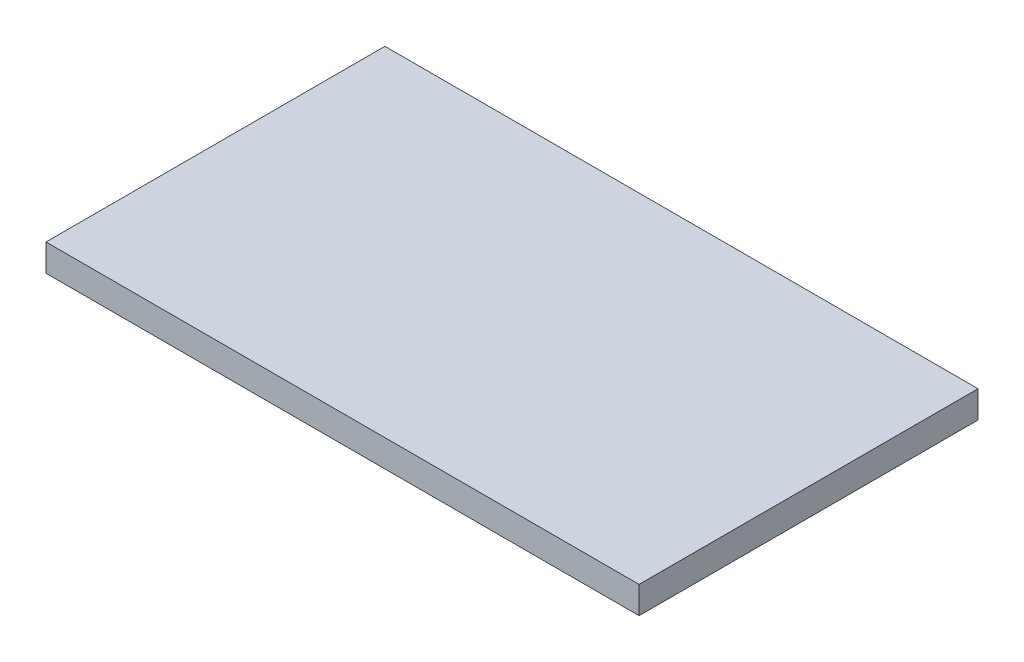
ISO-10303-21;
HEADER;
FILE_DESCRIPTION(('STEP AP214'),'2;1');
FILE_NAME('part.step','',(''),(''),'','','');
FILE_SCHEMA(('AUTOMOTIVE_DESIGN { 1 0 10303 214 1 1 1 1 }'));
ENDSEC;
DATA;
#1=APPLICATION_CONTEXT('core data for automotive mechanical design processes');
#2=APPLICATION_PROTOCOL_DEFINITION('international standard','automotive_design',2000,#1);
#3=PRODUCT_CONTEXT('',#1,'mechanical');
#4=PRODUCT('Part','Part','',(#3));
#5=PRODUCT_RELATED_PRODUCT_CATEGORY('part','',(#4));
#6=PRODUCT_DEFINITION_FORMATION('','',#4);
#7=PRODUCT_DEFINITION_CONTEXT('part definition',#1,'design');
#8=PRODUCT_DEFINITION('design','',#6,#7);
#9=PRODUCT_DEFINITION_SHAPE('','',#8);
#10=(LENGTH_UNIT() NAMED_UNIT(*) SI_UNIT(.MILLI.,.METRE.));
#11=(NAMED_UNIT(*) PLANE_ANGLE_UNIT() SI_UNIT($,.RADIAN.));
#12=(NAMED_UNIT(*) SI_UNIT($,.STERADIAN.) SOLID_ANGLE_UNIT());
#13=UNCERTAINTY_MEASURE_WITH_UNIT(LENGTH_MEASURE(1.E-05),#10,'distance_accuracy_value','');
#14=(GEOMETRIC_REPRESENTATION_CONTEXT(3) GLOBAL_UNCERTAINTY_ASSIGNED_CONTEXT((#13)) GLOBAL_UNIT_ASSIGNED_CONTEXT((#10,
#11,#12)) REPRESENTATION_CONTEXT('',''));
#15=CARTESIAN_POINT('',(0.,0.,0.));
#16=DIRECTION('',(0.,0.,1.));
#17=DIRECTION('',(1.,0.,0.));
#18=AXIS2_PLACEMENT_3D('',#15,#16,#17);
#19=CARTESIAN_POINT('',(0.,1.6,0.));
#20=DIRECTION('',(1.,0.,0.));
#21=DIRECTION('',(0.,0.,-1.));
#22=AXIS2_PLACEMENT_3D('',#19,#20,#21);
#23=PLANE('',#22);
#24=DIRECTION('',(0.,0.,1.));
#25=VECTOR('',#24,1.);
#26=CARTESIAN_POINT('',(0.,0.,0.));
#27=LINE('',#26,#25);
#28=CARTESIAN_POINT('',(0.,0.,-20.));
#29=VERTEX_POINT('',#28);
#30=CARTESIAN_POINT('',(0.,0.,0.));
#31=VERTEX_POINT('',#30);
#32=EDGE_CURVE('E98',#29,#31,#27,.T.);
#33=ORIENTED_EDGE('',*,*,#32,.T.);
#34=DIRECTION('',(0.,-1.,0.));
#35=VECTOR('',#34,1.);
#36=CARTESIAN_POINT('',(0.,1.6,0.));
#37=LINE('',#36,#35);
#38=CARTESIAN_POINT('',(0.,1.6,0.));
#39=VERTEX_POINT('',#38);
#40=EDGE_CURVE('E11',#39,#31,#37,.T.);
#41=ORIENTED_EDGE('',*,*,#40,.F.);
#42=DIRECTION('',(0.,0.,1.));
#43=VECTOR('',#42,1.);
#44=CARTESIAN_POINT('',(0.,1.6,0.));
#45=LINE('',#44,#43);
#46=CARTESIAN_POINT('',(0.,1.6,-20.));
#47=VERTEX_POINT('',#46);
#48=EDGE_CURVE('E86',#47,#39,#45,.T.);
#49=ORIENTED_EDGE('',*,*,#48,.F.);
#50=DIRECTION('',(0.,-1.,0.));
#51=VECTOR('',#50,1.);
#52=CARTESIAN_POINT('',(0.,1.6,-20.));
#53=LINE('',#52,#51);
#54=EDGE_CURVE('E94',#47,#29,#53,.T.);
#55=ORIENTED_EDGE('',*,*,#54,.T.);
#56=EDGE_LOOP('',(#33,#41,#49,#55));
#57=FACE_BOUND('',#56,.T.);
#58=ADVANCED_FACE('F35',(#57),#23,.F.);
#59=CARTESIAN_POINT('',(0.,1.6,0.));
#60=DIRECTION('',(0.,0.,-1.));
#61=DIRECTION('',(-1.,0.,0.));
#62=AXIS2_PLACEMENT_3D('',#59,#60,#61);
#63=PLANE('',#62);
#64=DIRECTION('',(1.,0.,0.));
#65=VECTOR('',#64,1.);
#66=CARTESIAN_POINT('',(0.,0.,0.));
#67=LINE('',#66,#65);
#68=CARTESIAN_POINT('',(35.,0.,0.));
#69=VERTEX_POINT('',#68);
#70=EDGE_CURVE('E90',#31,#69,#67,.T.);
#71=ORIENTED_EDGE('',*,*,#70,.T.);
#72=DIRECTION('',(0.,-1.,0.));
#73=VECTOR('',#72,1.);
#74=CARTESIAN_POINT('',(35.,1.6,0.));
#75=LINE('',#74,#73);
#76=CARTESIAN_POINT('',(35.,1.6,0.));
#77=VERTEX_POINT('',#76);
#78=EDGE_CURVE('E43',#77,#69,#75,.T.);
#79=ORIENTED_EDGE('',*,*,#78,.F.);
#80=DIRECTION('',(1.,0.,0.));
#81=VECTOR('',#80,1.);
#82=CARTESIAN_POINT('',(0.,1.6,0.));
#83=LINE('',#82,#81);
#84=EDGE_CURVE('E81',#39,#77,#83,.T.);
#85=ORIENTED_EDGE('',*,*,#84,.F.);
#86=ORIENTED_EDGE('',*,*,#40,.T.);
#87=EDGE_LOOP('',(#71,#79,#85,#86));
#88=FACE_BOUND('',#87,.T.);
#89=ADVANCED_FACE('F89',(#88),#63,.F.);
#90=CARTESIAN_POINT('',(35.,1.6,0.));
#91=DIRECTION('',(-1.,0.,0.));
#92=DIRECTION('',(0.,0.,1.));
#93=AXIS2_PLACEMENT_3D('',#90,#91,#92);
#94=PLANE('',#93);
#95=DIRECTION('',(0.,0.,-1.));
#96=VECTOR('',#95,1.);
#97=CARTESIAN_POINT('',(35.,0.,0.));
#98=LINE('',#97,#96);
#99=CARTESIAN_POINT('',(35.,0.,-20.));
#100=VERTEX_POINT('',#99);
#101=EDGE_CURVE('E68',#69,#100,#98,.T.);
#102=ORIENTED_EDGE('',*,*,#101,.T.);
#103=DIRECTION('',(0.,-1.,0.));
#104=VECTOR('',#103,1.);
#105=CARTESIAN_POINT('',(35.,1.6,-20.));
#106=LINE('',#105,#104);
#107=CARTESIAN_POINT('',(35.,1.6,-20.));
#108=VERTEX_POINT('',#107);
#109=EDGE_CURVE('E91',#108,#100,#106,.T.);
#110=ORIENTED_EDGE('',*,*,#109,.F.);
#111=DIRECTION('',(0.,0.,-1.));
#112=VECTOR('',#111,1.);
#113=CARTESIAN_POINT('',(35.,1.6,0.));
#114=LINE('',#113,#112);
#115=EDGE_CURVE('E84',#77,#108,#114,.T.);
#116=ORIENTED_EDGE('',*,*,#115,.F.);
#117=ORIENTED_EDGE('',*,*,#78,.T.);
#118=EDGE_LOOP('',(#102,#110,#116,#117));
#119=FACE_BOUND('',#118,.T.);
#120=ADVANCED_FACE('F92',(#119),#94,.F.);
#121=CARTESIAN_POINT('',(0.,1.6,-20.));
#122=DIRECTION('',(0.,0.,1.));
#123=DIRECTION('',(1.,0.,0.));
#124=AXIS2_PLACEMENT_3D('',#121,#122,#123);
#125=PLANE('',#124);
#126=DIRECTION('',(-1.,0.,0.));
#127=VECTOR('',#126,1.);
#128=CARTESIAN_POINT('',(0.,0.,-20.));
#129=LINE('',#128,#127);
#130=EDGE_CURVE('E74',#100,#29,#129,.T.);
#131=ORIENTED_EDGE('',*,*,#130,.T.);
#132=ORIENTED_EDGE('',*,*,#54,.F.);
#133=DIRECTION('',(-1.,0.,0.));
#134=VECTOR('',#133,1.);
#135=CARTESIAN_POINT('',(0.,1.6,-20.));
#136=LINE('',#135,#134);
#137=EDGE_CURVE('E51',#108,#47,#136,.T.);
#138=ORIENTED_EDGE('',*,*,#137,.F.);
#139=ORIENTED_EDGE('',*,*,#109,.T.);
#140=EDGE_LOOP('',(#131,#132,#138,#139));
#141=FACE_BOUND('',#140,.T.);
#142=ADVANCED_FACE('F105',(#141),#125,.F.);
#143=CARTESIAN_POINT('',(0.,1.6,0.));
#144=DIRECTION('',(0.,-1.,0.));
#145=DIRECTION('',(0.,0.,-1.));
#146=AXIS2_PLACEMENT_3D('',#143,#144,#145);
#147=PLANE('',#146);
#148=ORIENTED_EDGE('',*,*,#48,.T.);
#149=ORIENTED_EDGE('',*,*,#84,.T.);
#150=ORIENTED_EDGE('',*,*,#115,.T.);
#151=ORIENTED_EDGE('',*,*,#137,.T.);
#152=EDGE_LOOP('',(#148,#149,#150,#151));
#153=FACE_BOUND('',#152,.T.);
#154=ADVANCED_FACE('F82',(#153),#147,.F.);
#155=CARTESIAN_POINT('',(0.,0.,0.));
#156=DIRECTION('',(0.,-1.,0.));
#157=DIRECTION('',(0.,0.,-1.));
#158=AXIS2_PLACEMENT_3D('',#155,#156,#157);
#159=PLANE('',#158);
#160=ORIENTED_EDGE('',*,*,#32,.F.);
#161=ORIENTED_EDGE('',*,*,#130,.F.);
#162=ORIENTED_EDGE('',*,*,#101,.F.);
#163=ORIENTED_EDGE('',*,*,#70,.F.);
#164=EDGE_LOOP('',(#160,#161,#162,#163));
#165=FACE_BOUND('',#164,.T.);
#166=ADVANCED_FACE('F108',(#165),#159,.T.);
#167=CLOSED_SHELL('',(#58,#89,#120,#142,#154,#166));
#168=MANIFOLD_SOLID_BREP('B2',#167);
#169=ADVANCED_BREP_SHAPE_REPRESENTATION('',(#18,#168),#14);
#170=SHAPE_DEFINITION_REPRESENTATION(#9,#169);
ENDSEC;
END-ISO-10303-21;
